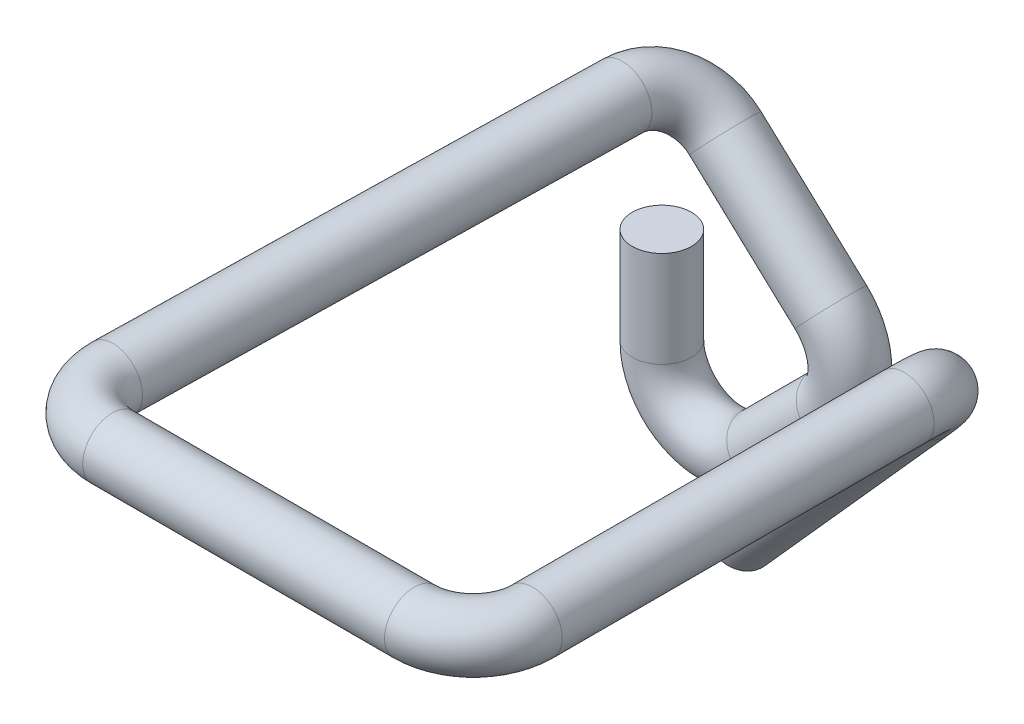
ISO-10303-21;
HEADER;
FILE_DESCRIPTION(('STEP AP214'),'2;1');
FILE_NAME('part.step','',(''),(''),'','','');
FILE_SCHEMA(('AUTOMOTIVE_DESIGN { 1 0 10303 214 1 1 1 1 }'));
ENDSEC;
DATA;
#1=APPLICATION_CONTEXT('core data for automotive mechanical design processes');
#2=APPLICATION_PROTOCOL_DEFINITION('international standard','automotive_design',2000,#1);
#3=PRODUCT_CONTEXT('',#1,'mechanical');
#4=PRODUCT('Part','Part','',(#3));
#5=PRODUCT_RELATED_PRODUCT_CATEGORY('part','',(#4));
#6=PRODUCT_DEFINITION_FORMATION('','',#4);
#7=PRODUCT_DEFINITION_CONTEXT('part definition',#1,'design');
#8=PRODUCT_DEFINITION('design','',#6,#7);
#9=PRODUCT_DEFINITION_SHAPE('','',#8);
#10=(LENGTH_UNIT() NAMED_UNIT(*) SI_UNIT(.MILLI.,.METRE.));
#11=(NAMED_UNIT(*) PLANE_ANGLE_UNIT() SI_UNIT($,.RADIAN.));
#12=(NAMED_UNIT(*) SI_UNIT($,.STERADIAN.) SOLID_ANGLE_UNIT());
#13=UNCERTAINTY_MEASURE_WITH_UNIT(LENGTH_MEASURE(1.E-05),#10,'distance_accuracy_value','');
#14=(GEOMETRIC_REPRESENTATION_CONTEXT(3) GLOBAL_UNCERTAINTY_ASSIGNED_CONTEXT((#13)) GLOBAL_UNIT_ASSIGNED_CONTEXT((#10,
#11,#12)) REPRESENTATION_CONTEXT('',''));
#15=CARTESIAN_POINT('',(0.,0.,0.));
#16=DIRECTION('',(0.,0.,1.));
#17=DIRECTION('',(1.,0.,0.));
#18=AXIS2_PLACEMENT_3D('',#15,#16,#17);
#19=CARTESIAN_POINT('',(44.2167343286428,30.8877886340042,27.3423018990115));
#20=DIRECTION('',(0.66668901125775,0.745336006287207,0.));
#21=DIRECTION('',(-0.745336006287207,0.66668901125775,0.));
#22=AXIS2_PLACEMENT_3D('',#19,#20,#21);
#23=PLANE('',#22);
#24=CARTESIAN_POINT('',(44.2167343286428,30.8877886340042,27.3423018990115));
#25=DIRECTION('',(0.66668901125775,0.745336006287207,0.));
#26=DIRECTION('',(-0.745336006287207,0.66668901125775,0.));
#27=AXIS2_PLACEMENT_3D('',#24,#25,#26);
#28=CIRCLE('',#27,6.35);
#29=CARTESIAN_POINT('',(39.4838506887191,35.1212638554909,27.3423018990115));
#30=VERTEX_POINT('',#29);
#31=EDGE_CURVE('E89',#30,#30,#28,.T.);
#32=ORIENTED_EDGE('',*,*,#31,.F.);
#33=EDGE_LOOP('',(#32));
#34=FACE_BOUND('',#33,.T.);
#35=ADVANCED_FACE('F43',(#34),#23,.F.);
#36=CARTESIAN_POINT('',(0.,51.2515517992824,0.));
#37=DIRECTION('',(0.,1.,0.));
#38=DIRECTION('',(-0.994183687456546,0.,0.107697704689123));
#39=AXIS2_PLACEMENT_3D('',#36,#37,#38);
#40=PLANE('',#39);
#41=CARTESIAN_POINT('',(0.,51.2515517992824,0.));
#42=DIRECTION('',(0.,1.,0.));
#43=DIRECTION('',(-0.994183687456546,0.,0.107697704689123));
#44=AXIS2_PLACEMENT_3D('',#41,#42,#43);
#45=CIRCLE('',#44,6.35);
#46=CARTESIAN_POINT('',(-6.31306641534906,51.2515517992824,0.68388042477593));
#47=VERTEX_POINT('',#46);
#48=EDGE_CURVE('E11',#47,#47,#45,.T.);
#49=ORIENTED_EDGE('',*,*,#48,.T.);
#50=EDGE_LOOP('',(#49));
#51=FACE_BOUND('',#50,.T.);
#52=ADVANCED_FACE('F96',(#51),#40,.T.);
#53=CARTESIAN_POINT('',(44.2167343286428,30.8877886340042,27.3423018990115));
#54=DIRECTION('',(0.66668901125775,0.745336006287207,0.));
#55=DIRECTION('',(-0.745336006287207,0.66668901125775,0.));
#56=AXIS2_PLACEMENT_3D('',#53,#54,#55);
#57=CYLINDRICAL_SURFACE('',#56,6.35);
#58=CARTESIAN_POINT('',(83.586094699931,74.9014161780665,27.3423018990115));
#59=DIRECTION('',(0.66668901125775,0.745336006287207,0.));
#60=DIRECTION('',(-0.745336006287207,0.66668901125775,0.));
#61=AXIS2_PLACEMENT_3D('',#58,#59,#60);
#62=CIRCLE('',#61,6.35);
#63=CARTESIAN_POINT('',(83.586094699931,74.9014161780666,20.9923018990115));
#64=VERTEX_POINT('',#63);
#65=EDGE_CURVE('E86',#64,#64,#62,.T.);
#66=ORIENTED_EDGE('',*,*,#65,.F.);
#67=EDGE_LOOP('',(#66));
#68=FACE_BOUND('',#67,.T.);
#69=ORIENTED_EDGE('',*,*,#31,.T.);
#70=EDGE_LOOP('',(#69));
#71=FACE_BOUND('',#70,.T.);
#72=ADVANCED_FACE('F93',(#68,#71),#57,.T.);
#73=CARTESIAN_POINT('',(83.5860946999311,74.9014161780665,40.0423018990115));
#74=DIRECTION('',(0.745336006287207,-0.66668901125775,0.));
#75=DIRECTION('',(0.66668901125775,0.745336006287207,0.));
#76=AXIS2_PLACEMENT_3D('',#73,#74,#75);
#77=TOROIDAL_SURFACE('',#76,12.7,6.35);
#78=CARTESIAN_POINT('',(92.0530451429045,84.3671834579141,40.0423018990115));
#79=DIRECTION('',(0.,0.,1.));
#80=DIRECTION('',(-0.745336006287206,0.666689011257751,0.));
#81=AXIS2_PLACEMENT_3D('',#78,#79,#80);
#82=CIRCLE('',#81,6.35);
#83=CARTESIAN_POINT('',(96.2865203643912,89.1000670978378,40.0423018990115));
#84=VERTEX_POINT('',#83);
#85=EDGE_CURVE('E83',#84,#84,#82,.T.);
#86=CARTESIAN_POINT('',(83.5860946999311,74.9014161780665,40.0423018990115));
#87=DIRECTION('',(0.745336006287207,-0.66668901125775,0.));
#88=DIRECTION('',(0.66668901125775,0.745336006287207,0.));
#89=AXIS2_PLACEMENT_3D('',#86,#87,#88);
#90=CIRCLE('',#89,19.05);
#91=EDGE_CURVE('',#64,#84,#90,.T.);
#92=ORIENTED_EDGE('',*,*,#65,.T.);
#93=ORIENTED_EDGE('',*,*,#85,.F.);
#94=ORIENTED_EDGE('',*,*,#91,.T.);
#95=ORIENTED_EDGE('',*,*,#91,.F.);
#96=EDGE_LOOP('',(#92,#94,#93,#95));
#97=FACE_BOUND('',#96,.T.);
#98=ADVANCED_FACE('F146',(#97),#77,.T.);
#99=CARTESIAN_POINT('',(92.0530451429045,84.3671834579141,40.0423018990115));
#100=DIRECTION('',(0.,0.,1.));
#101=DIRECTION('',(1.,0.,0.));
#102=AXIS2_PLACEMENT_3D('',#99,#100,#101);
#103=CYLINDRICAL_SURFACE('',#102,6.35);
#104=CARTESIAN_POINT('',(92.0530451429045,84.3671834579141,119.757681027915));
#105=DIRECTION('',(0.,0.,1.));
#106=DIRECTION('',(-0.745336006287206,0.666689011257751,0.));
#107=AXIS2_PLACEMENT_3D('',#104,#105,#106);
#108=CIRCLE('',#107,6.35);
#109=CARTESIAN_POINT('',(98.4030451429045,84.3671834579141,119.757681027915));
#110=VERTEX_POINT('',#109);
#111=EDGE_CURVE('E80',#110,#110,#108,.T.);
#112=ORIENTED_EDGE('',*,*,#111,.F.);
#113=EDGE_LOOP('',(#112));
#114=FACE_BOUND('',#113,.T.);
#115=ORIENTED_EDGE('',*,*,#85,.T.);
#116=EDGE_LOOP('',(#115));
#117=FACE_BOUND('',#116,.T.);
#118=ADVANCED_FACE('F142',(#114,#117),#103,.T.);
#119=CARTESIAN_POINT('',(79.3530451429045,84.3671834579141,119.757681027915));
#120=DIRECTION('',(0.,-1.,0.));
#121=DIRECTION('',(0.,0.,-1.));
#122=AXIS2_PLACEMENT_3D('',#119,#120,#121);
#123=TOROIDAL_SURFACE('',#122,12.7,6.35);
#124=CARTESIAN_POINT('',(79.3530451429045,84.3671834579141,132.457681027915));
#125=DIRECTION('',(-1.,0.,0.));
#126=DIRECTION('',(0.,0.666689011257751,-0.745336006287206));
#127=AXIS2_PLACEMENT_3D('',#124,#125,#126);
#128=CIRCLE('',#127,6.35);
#129=CARTESIAN_POINT('',(79.3530451429045,84.3671834579141,138.807681027915));
#130=VERTEX_POINT('',#129);
#131=EDGE_CURVE('E77',#130,#130,#128,.T.);
#132=CARTESIAN_POINT('',(79.3530451429045,84.3671834579141,119.757681027915));
#133=DIRECTION('',(0.,-1.,0.));
#134=DIRECTION('',(0.,0.,-1.));
#135=AXIS2_PLACEMENT_3D('',#132,#133,#134);
#136=CIRCLE('',#135,19.05);
#137=EDGE_CURVE('',#110,#130,#136,.T.);
#138=ORIENTED_EDGE('',*,*,#111,.T.);
#139=ORIENTED_EDGE('',*,*,#131,.F.);
#140=ORIENTED_EDGE('',*,*,#137,.T.);
#141=ORIENTED_EDGE('',*,*,#137,.F.);
#142=EDGE_LOOP('',(#138,#140,#139,#141));
#143=FACE_BOUND('',#142,.T.);
#144=ADVANCED_FACE('F138',(#143),#123,.T.);
#145=CARTESIAN_POINT('',(79.3530451429045,84.3671834579141,132.457681027915));
#146=DIRECTION('',(-1.,0.,0.));
#147=DIRECTION('',(0.,0.,1.));
#148=AXIS2_PLACEMENT_3D('',#145,#146,#147);
#149=CYLINDRICAL_SURFACE('',#148,6.35);
#150=CARTESIAN_POINT('',(14.6373852729545,84.3671834579141,132.457681027915));
#151=DIRECTION('',(-1.,0.,0.));
#152=DIRECTION('',(0.,0.666689011257751,-0.745336006287206));
#153=AXIS2_PLACEMENT_3D('',#150,#151,#152);
#154=CIRCLE('',#153,6.35);
#155=CARTESIAN_POINT('',(14.6373852729545,84.3671834579141,138.807681027915));
#156=VERTEX_POINT('',#155);
#157=EDGE_CURVE('E74',#156,#156,#154,.T.);
#158=ORIENTED_EDGE('',*,*,#157,.F.);
#159=EDGE_LOOP('',(#158));
#160=FACE_BOUND('',#159,.T.);
#161=ORIENTED_EDGE('',*,*,#131,.T.);
#162=EDGE_LOOP('',(#161));
#163=FACE_BOUND('',#162,.T.);
#164=ADVANCED_FACE('F134',(#160,#163),#149,.T.);
#165=CARTESIAN_POINT('',(14.6373852729546,84.3671834579141,119.757681027915));
#166=DIRECTION('',(0.,-1.,0.));
#167=DIRECTION('',(0.,0.,-1.));
#168=AXIS2_PLACEMENT_3D('',#165,#166,#167);
#169=TOROIDAL_SURFACE('',#168,12.7,6.35);
#170=CARTESIAN_POINT('',(1.94011587627857,84.3671834579141,119.494337396446));
#171=DIRECTION('',(0.020735719013341,0.,-0.999784991864251));
#172=DIRECTION('',(0.745175752981988,0.666689011257751,0.0154550779968973));
#173=AXIS2_PLACEMENT_3D('',#170,#171,#172);
#174=CIRCLE('',#173,6.35);
#175=CARTESIAN_POINT('',(-4.40851882205942,84.3671834579141,119.362665580711));
#176=VERTEX_POINT('',#175);
#177=EDGE_CURVE('E71',#176,#176,#174,.T.);
#178=CARTESIAN_POINT('',(14.6373852729546,84.3671834579141,119.757681027915));
#179=DIRECTION('',(0.,-1.,0.));
#180=DIRECTION('',(0.,0.,-1.));
#181=AXIS2_PLACEMENT_3D('',#178,#179,#180);
#182=CIRCLE('',#181,19.05);
#183=EDGE_CURVE('',#156,#176,#182,.T.);
#184=ORIENTED_EDGE('',*,*,#157,.T.);
#185=ORIENTED_EDGE('',*,*,#177,.F.);
#186=ORIENTED_EDGE('',*,*,#183,.T.);
#187=ORIENTED_EDGE('',*,*,#183,.F.);
#188=EDGE_LOOP('',(#184,#186,#185,#187));
#189=FACE_BOUND('',#188,.T.);
#190=ADVANCED_FACE('F130',(#189),#169,.T.);
#191=CARTESIAN_POINT('',(1.94011587627858,84.3671834579141,119.494337396446));
#192=DIRECTION('',(0.0207357190133426,0.,-0.999784991864251));
#193=DIRECTION('',(-0.999784991864251,0.,-0.0207357190133426));
#194=AXIS2_PLACEMENT_3D('',#191,#192,#193);
#195=CYLINDRICAL_SURFACE('',#194,6.35);
#196=CARTESIAN_POINT('',(4.15908228511446,84.3671834579141,12.5055557883658));
#197=DIRECTION('',(0.0207357190133426,0.,-0.999784991864251));
#198=DIRECTION('',(0.745175752981988,0.666689011257751,0.0154550779968985));
#199=AXIS2_PLACEMENT_3D('',#196,#197,#198);
#200=CIRCLE('',#199,6.35);
#201=CARTESIAN_POINT('',(-0.4981370619579,88.6826762482965,12.4089642286302));
#202=VERTEX_POINT('',#201);
#203=EDGE_CURVE('E68',#202,#202,#200,.T.);
#204=ORIENTED_EDGE('',*,*,#203,.F.);
#205=EDGE_LOOP('',(#204));
#206=FACE_BOUND('',#205,.T.);
#207=ORIENTED_EDGE('',*,*,#177,.T.);
#208=EDGE_LOOP('',(#207));
#209=FACE_BOUND('',#208,.T.);
#210=ADVANCED_FACE('F126',(#206,#209),#195,.T.);
#211=CARTESIAN_POINT('',(13.4735209792592,75.7361978771492,12.698738907837));
#212=DIRECTION('',(-0.67945904320043,-0.733578094876301,-0.0140921017173973));
#213=DIRECTION('',(0.733650945384774,-0.679526519229403,0.));
#214=AXIS2_PLACEMENT_3D('',#211,#212,#213);
#215=TOROIDAL_SURFACE('',#214,12.7,6.35);
#216=CARTESIAN_POINT('',(13.595135630983,75.8674991607415,0.));
#217=DIRECTION('',(0.733650945384773,-0.679526519229403,0.));
#218=DIRECTION('',(0.675574180611999,0.729383802188615,0.107697704689123));
#219=AXIS2_PLACEMENT_3D('',#216,#217,#218);
#220=CIRCLE('',#219,6.35);
#221=CARTESIAN_POINT('',(13.6559429568449,75.9331498025377,-6.34936945391849));
#222=VERTEX_POINT('',#221);
#223=EDGE_CURVE('E65',#222,#222,#220,.T.);
#224=CARTESIAN_POINT('',(13.4735209792592,75.7361978771492,12.698738907837));
#225=DIRECTION('',(-0.67945904320043,-0.733578094876301,-0.0140921017173973));
#226=DIRECTION('',(0.733650945384774,-0.679526519229403,0.));
#227=AXIS2_PLACEMENT_3D('',#224,#225,#226);
#228=CIRCLE('',#227,19.05);
#229=EDGE_CURVE('',#202,#222,#228,.T.);
#230=ORIENTED_EDGE('',*,*,#203,.T.);
#231=ORIENTED_EDGE('',*,*,#223,.F.);
#232=ORIENTED_EDGE('',*,*,#229,.T.);
#233=ORIENTED_EDGE('',*,*,#229,.F.);
#234=EDGE_LOOP('',(#230,#232,#231,#233));
#235=FACE_BOUND('',#234,.T.);
#236=ADVANCED_FACE('F122',(#235),#215,.T.);
#237=CARTESIAN_POINT('',(13.595135630983,75.8674991607415,0.));
#238=DIRECTION('',(0.733650945384774,-0.679526519229402,0.));
#239=DIRECTION('',(0.679526519229402,0.733650945384774,0.));
#240=AXIS2_PLACEMENT_3D('',#237,#238,#239);
#241=CYLINDRICAL_SURFACE('',#240,6.35);
#242=CARTESIAN_POINT('',(36.2427756109695,54.8906680652817,0.));
#243=DIRECTION('',(0.733650945384774,-0.679526519229402,0.));
#244=DIRECTION('',(0.675574180611998,0.729383802188615,0.107697704689123));
#245=AXIS2_PLACEMENT_3D('',#242,#243,#244);
#246=CIRCLE('',#245,6.35);
#247=CARTESIAN_POINT('',(40.5577690080762,59.549351568475,0.));
#248=VERTEX_POINT('',#247);
#249=EDGE_CURVE('E62',#248,#248,#246,.T.);
#250=ORIENTED_EDGE('',*,*,#249,.F.);
#251=EDGE_LOOP('',(#250));
#252=FACE_BOUND('',#251,.T.);
#253=ORIENTED_EDGE('',*,*,#223,.T.);
#254=EDGE_LOOP('',(#253));
#255=FACE_BOUND('',#254,.T.);
#256=ADVANCED_FACE('F118',(#252,#255),#241,.T.);
#257=CARTESIAN_POINT('',(27.6127888167561,45.573301058895,0.));
#258=DIRECTION('',(0.,0.,-1.));
#259=DIRECTION('',(-1.,0.,0.));
#260=AXIS2_PLACEMENT_3D('',#257,#258,#259);
#261=TOROIDAL_SURFACE('',#260,12.7,6.35);
#262=CARTESIAN_POINT('',(36.5930449378253,36.5930449378259,0.));
#263=DIRECTION('',(-0.707106781186541,-0.707106781186553,0.));
#264=DIRECTION('',(0.702994027145577,-0.702994027145565,0.107697704689123));
#265=AXIS2_PLACEMENT_3D('',#262,#263,#264);
#266=CIRCLE('',#265,6.35);
#267=CARTESIAN_POINT('',(41.0831729983599,32.1029168772914,0.));
#268=VERTEX_POINT('',#267);
#269=EDGE_CURVE('E57',#268,#268,#266,.T.);
#270=CARTESIAN_POINT('',(27.6127888167561,45.573301058895,0.));
#271=DIRECTION('',(0.,0.,-1.));
#272=DIRECTION('',(-1.,0.,0.));
#273=AXIS2_PLACEMENT_3D('',#270,#271,#272);
#274=CIRCLE('',#273,19.05);
#275=EDGE_CURVE('',#248,#268,#274,.T.);
#276=ORIENTED_EDGE('',*,*,#249,.T.);
#277=ORIENTED_EDGE('',*,*,#269,.F.);
#278=ORIENTED_EDGE('',*,*,#275,.T.);
#279=ORIENTED_EDGE('',*,*,#275,.F.);
#280=EDGE_LOOP('',(#276,#278,#277,#279));
#281=FACE_BOUND('',#280,.T.);
#282=ADVANCED_FACE('F114',(#281),#261,.T.);
#283=CARTESIAN_POINT('',(36.5930449378253,36.5930449378259,0.));
#284=DIRECTION('',(-0.707106781186541,-0.707106781186554,0.));
#285=DIRECTION('',(0.707106781186554,-0.707106781186541,0.));
#286=AXIS2_PLACEMENT_3D('',#283,#284,#285);
#287=CYLINDRICAL_SURFACE('',#286,6.35);
#288=CARTESIAN_POINT('',(21.6802561210692,21.6802561210696,0.));
#289=DIRECTION('',(-0.707106781186541,-0.707106781186554,0.));
#290=DIRECTION('',(0.702994027145577,-0.702994027145564,0.107697704689123));
#291=AXIS2_PLACEMENT_3D('',#288,#289,#290);
#292=CIRCLE('',#291,6.35);
#293=CARTESIAN_POINT('',(26.1703841816039,17.1901280605351,0.));
#294=VERTEX_POINT('',#293);
#295=EDGE_CURVE('E53',#294,#294,#292,.T.);
#296=CARTESIAN_POINT('',(26.1703841816039,17.1901280605351,0.));
#297=CARTESIAN_POINT('',(26.3257257317784,17.3454696107096,0.));
#298=CARTESIAN_POINT('',(26.4810672819529,17.5008111608842,0.));
#299=CARTESIAN_POINT('',(26.791750382302,17.8114942612332,0.));
#300=CARTESIAN_POINT('',(26.9470919324766,17.9668358114078,0.));
#301=CARTESIAN_POINT('',(27.2577750328257,18.2775189117569,0.));
#302=CARTESIAN_POINT('',(27.4131165830002,18.4328604619314,0.));
#303=CARTESIAN_POINT('',(27.7237996833493,18.7435435622805,0.));
#304=CARTESIAN_POINT('',(27.8791412335238,18.8988851124551,0.));
#305=CARTESIAN_POINT('',(28.1898243338729,19.2095682128042,0.));
#306=CARTESIAN_POINT('',(28.3451658840475,19.3649097629787,0.));
#307=CARTESIAN_POINT('',(28.6558489843965,19.6755928633278,0.));
#308=CARTESIAN_POINT('',(28.8111905345711,19.8309344135023,0.));
#309=CARTESIAN_POINT('',(29.1218736349202,20.1416175138514,0.));
#310=CARTESIAN_POINT('',(29.2772151850947,20.296959064026,0.));
#311=CARTESIAN_POINT('',(29.5878982854438,20.6076421643751,0.));
#312=CARTESIAN_POINT('',(29.7432398356183,20.7629837145496,0.));
#313=CARTESIAN_POINT('',(30.0539229359674,21.0736668148987,0.));
#314=CARTESIAN_POINT('',(30.209264486142,21.2290083650732,0.));
#315=CARTESIAN_POINT('',(30.519947586491,21.5396914654223,0.));
#316=CARTESIAN_POINT('',(30.6752891366656,21.6950330155969,0.));
#317=CARTESIAN_POINT('',(30.9859722370147,22.005716115946,0.));
#318=CARTESIAN_POINT('',(31.1413137871892,22.1610576661205,0.));
#319=CARTESIAN_POINT('',(31.4519968875383,22.4717407664696,0.));
#320=CARTESIAN_POINT('',(31.6073384377128,22.6270823166442,0.));
#321=CARTESIAN_POINT('',(31.9180215380619,22.9377654169932,0.));
#322=CARTESIAN_POINT('',(32.0733630882365,23.0931069671678,0.));
#323=CARTESIAN_POINT('',(32.3840461885856,23.4037900675169,0.));
#324=CARTESIAN_POINT('',(32.5393877387601,23.5591316176914,0.));
#325=CARTESIAN_POINT('',(32.8500708391092,23.8698147180405,0.));
#326=CARTESIAN_POINT('',(33.0054123892837,24.0251562682151,0.));
#327=CARTESIAN_POINT('',(33.3160954896328,24.3358393685641,0.));
#328=CARTESIAN_POINT('',(33.4714370398074,24.4911809187387,0.));
#329=CARTESIAN_POINT('',(33.7821201401564,24.8018640190878,0.));
#330=CARTESIAN_POINT('',(33.937461690331,24.9572055692623,0.));
#331=CARTESIAN_POINT('',(34.2481447906801,25.2678886696114,0.));
#332=CARTESIAN_POINT('',(34.4034863408546,25.423230219786,0.));
#333=CARTESIAN_POINT('',(34.7141694412037,25.7339133201351,0.));
#334=CARTESIAN_POINT('',(34.8695109913782,25.8892548703096,0.));
#335=CARTESIAN_POINT('',(35.1801940917273,26.1999379706587,0.));
#336=CARTESIAN_POINT('',(35.3355356419019,26.3552795208332,0.));
#337=CARTESIAN_POINT('',(35.646218742251,26.6659626211823,0.));
#338=CARTESIAN_POINT('',(35.8015602924255,26.8213041713569,0.));
#339=CARTESIAN_POINT('',(36.1122433927746,27.131987271706,0.));
#340=CARTESIAN_POINT('',(36.2675849429491,27.2873288218805,0.));
#341=CARTESIAN_POINT('',(36.5782680432982,27.5980119222296,0.));
#342=CARTESIAN_POINT('',(36.7336095934727,27.7533534724041,0.));
#343=CARTESIAN_POINT('',(37.0442926938218,28.0640365727532,0.));
#344=CARTESIAN_POINT('',(37.1996342439964,28.2193781229278,0.));
#345=CARTESIAN_POINT('',(37.5103173443455,28.5300612232769,0.));
#346=CARTESIAN_POINT('',(37.66565889452,28.6854027734514,0.));
#347=CARTESIAN_POINT('',(37.9763419948691,28.9960858738005,0.));
#348=CARTESIAN_POINT('',(38.1316835450436,29.1514274239751,0.));
#349=CARTESIAN_POINT('',(38.4423666453927,29.4621105243241,0.));
#350=CARTESIAN_POINT('',(38.5977081955673,29.6174520744987,0.));
#351=CARTESIAN_POINT('',(38.9083912959163,29.9281351748478,0.));
#352=CARTESIAN_POINT('',(39.0637328460909,30.0834767250223,0.));
#353=CARTESIAN_POINT('',(39.37441594644,30.3941598253714,0.));
#354=CARTESIAN_POINT('',(39.5297574966145,30.549501375546,0.));
#355=CARTESIAN_POINT('',(39.8404405969636,30.860184475895,0.));
#356=CARTESIAN_POINT('',(39.9957821471382,31.0155260260696,0.));
#357=CARTESIAN_POINT('',(40.3064652474872,31.3262091264187,0.));
#358=CARTESIAN_POINT('',(40.4618067976618,31.4815506765932,0.));
#359=CARTESIAN_POINT('',(40.7724898980109,31.7922337769423,0.));
#360=CARTESIAN_POINT('',(40.9278314481854,31.9475753271169,0.));
#361=CARTESIAN_POINT('',(41.0831729983599,32.1029168772914,0.));
#362=B_SPLINE_CURVE_WITH_KNOTS('',3,(#296,#297,#298,#299,#300,#301,#302,#303,#304,#305,#306,
#307,#308,#309,#310,#311,#312,#313,#314,#315,#316,#317,#318,#319,#320,#321,#322,#323,#324,#325,
#326,#327,#328,#329,#330,#331,#332,#333,#334,#335,#336,#337,#338,#339,#340,#341,#342,#343,#344,
#345,#346,#347,#348,#349,#350,#351,#352,#353,#354,#355,#356,#357,#358,#359,#360,#361),
.UNSPECIFIED.,.F.,.F.,(4,2,2,2,2,2,2,2,2,2,2,2,2,2,2,2,2,2,2,2,2,2,2,2,2,2,2,2,2,2,2,2,4),(0.,
0.6590583811707,1.3181167623414,1.97717514351211,2.63623352468281,3.29529190585351,
3.95435028702421,4.61340866819491,5.27246704936562,5.93152543053632,6.59058381170702,
7.24964219287772,7.90870057404842,8.56775895521913,9.22681733638983,9.88587571756053,
10.5449340987312,11.2039924799019,11.8630508610726,12.5221092422433,13.181167623414,
13.8402260045847,14.4992843857554,15.1583427669261,15.8174011480968,16.4764595292675,
17.1355179104382,17.794576291609,18.4536346727796,19.1126930539504,19.7717514351211,
20.4308098162918,21.0898681974625),.UNSPECIFIED.);
#363=EDGE_CURVE('BSEAM108',#294,#268,#362,.T.);
#364=ORIENTED_EDGE('',*,*,#295,.F.);
#365=ORIENTED_EDGE('',*,*,#269,.T.);
#366=ORIENTED_EDGE('',*,*,#363,.T.);
#367=ORIENTED_EDGE('',*,*,#363,.F.);
#368=EDGE_LOOP('',(#364,#366,#365,#367));
#369=FACE_BOUND('',#368,.T.);
#370=ADVANCED_FACE('F108',(#369),#287,.T.);
#371=CARTESIAN_POINT('',(12.7,30.6605122421387,0.));
#372=DIRECTION('',(0.,0.,-1.));
#373=DIRECTION('',(-1.,0.,0.));
#374=AXIS2_PLACEMENT_3D('',#371,#372,#373);
#375=TOROIDAL_SURFACE('',#374,12.7,6.35);
#376=CARTESIAN_POINT('',(0.,30.6605122421387,0.));
#377=DIRECTION('',(0.,1.,0.));
#378=DIRECTION('',(-0.994183687456546,0.,0.107697704689123));
#379=AXIS2_PLACEMENT_3D('',#376,#377,#378);
#380=CIRCLE('',#379,6.35);
#381=CARTESIAN_POINT('',(-6.35000000000001,30.6605122421387,0.));
#382=VERTEX_POINT('',#381);
#383=EDGE_CURVE('E49',#382,#382,#380,.T.);
#384=CARTESIAN_POINT('',(12.7,30.6605122421387,0.));
#385=DIRECTION('',(0.,0.,-1.));
#386=DIRECTION('',(-1.,0.,0.));
#387=AXIS2_PLACEMENT_3D('',#384,#385,#386);
#388=CIRCLE('',#387,19.05);
#389=EDGE_CURVE('',#294,#382,#388,.T.);
#390=ORIENTED_EDGE('',*,*,#295,.T.);
#391=ORIENTED_EDGE('',*,*,#383,.F.);
#392=ORIENTED_EDGE('',*,*,#389,.T.);
#393=ORIENTED_EDGE('',*,*,#389,.F.);
#394=EDGE_LOOP('',(#390,#392,#391,#393));
#395=FACE_BOUND('',#394,.T.);
#396=ADVANCED_FACE('F102',(#395),#375,.T.);
#397=CARTESIAN_POINT('',(0.,30.6605122421387,0.));
#398=DIRECTION('',(0.,1.,0.));
#399=DIRECTION('',(-1.,0.,0.));
#400=AXIS2_PLACEMENT_3D('',#397,#398,#399);
#401=CYLINDRICAL_SURFACE('',#400,6.35);
#402=ORIENTED_EDGE('',*,*,#48,.F.);
#403=EDGE_LOOP('',(#402));
#404=FACE_BOUND('',#403,.T.);
#405=ORIENTED_EDGE('',*,*,#383,.T.);
#406=EDGE_LOOP('',(#405));
#407=FACE_BOUND('',#406,.T.);
#408=ADVANCED_FACE('F100',(#404,#407),#401,.T.);
#409=CLOSED_SHELL('',(#35,#52,#72,#98,#118,#144,#164,#190,#210,#236,#256,#282,#370,#396,#408));
#410=MANIFOLD_SOLID_BREP('B2',#409);
#411=ADVANCED_BREP_SHAPE_REPRESENTATION('',(#18,#410),#14);
#412=SHAPE_DEFINITION_REPRESENTATION(#9,#411);
ENDSEC;
END-ISO-10303-21;
